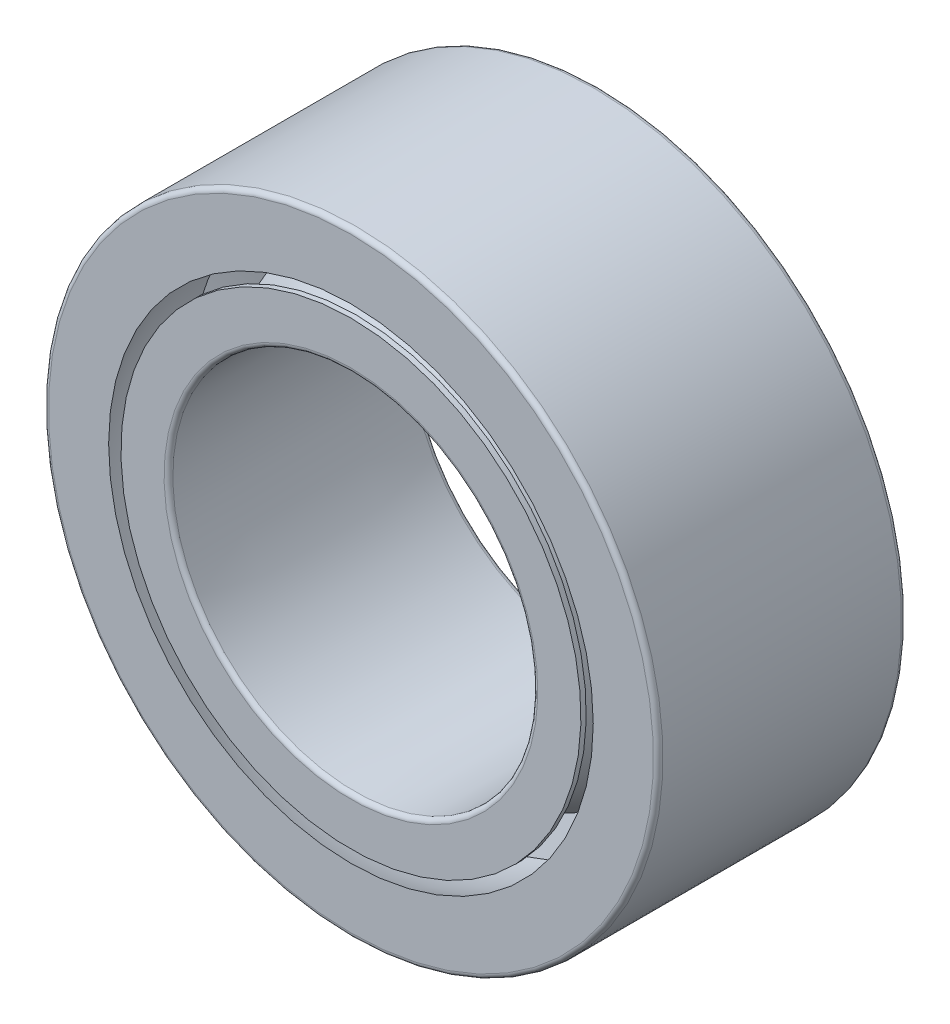
ISO-10303-21;
HEADER;
FILE_DESCRIPTION(('STEP AP214'),'2;1');
FILE_NAME('part.step','',(''),(''),'','','');
FILE_SCHEMA(('AUTOMOTIVE_DESIGN { 1 0 10303 214 1 1 1 1 }'));
ENDSEC;
DATA;
#1=APPLICATION_CONTEXT('core data for automotive mechanical design processes');
#2=APPLICATION_PROTOCOL_DEFINITION('international standard','automotive_design',2000,#1);
#3=PRODUCT_CONTEXT('',#1,'mechanical');
#4=PRODUCT('Part','Part','',(#3));
#5=PRODUCT_RELATED_PRODUCT_CATEGORY('part','',(#4));
#6=PRODUCT_DEFINITION_FORMATION('','',#4);
#7=PRODUCT_DEFINITION_CONTEXT('part definition',#1,'design');
#8=PRODUCT_DEFINITION('design','',#6,#7);
#9=PRODUCT_DEFINITION_SHAPE('','',#8);
#10=(LENGTH_UNIT() NAMED_UNIT(*) SI_UNIT(.MILLI.,.METRE.));
#11=(NAMED_UNIT(*) PLANE_ANGLE_UNIT() SI_UNIT($,.RADIAN.));
#12=(NAMED_UNIT(*) SI_UNIT($,.STERADIAN.) SOLID_ANGLE_UNIT());
#13=UNCERTAINTY_MEASURE_WITH_UNIT(LENGTH_MEASURE(1.E-05),#10,'distance_accuracy_value','');
#14=(GEOMETRIC_REPRESENTATION_CONTEXT(3) GLOBAL_UNCERTAINTY_ASSIGNED_CONTEXT((#13)) GLOBAL_UNIT_ASSIGNED_CONTEXT((#10,
#11,#12)) REPRESENTATION_CONTEXT('',''));
#15=CARTESIAN_POINT('',(0.,0.,0.));
#16=DIRECTION('',(0.,0.,1.));
#17=DIRECTION('',(1.,0.,0.));
#18=AXIS2_PLACEMENT_3D('',#15,#16,#17);
#19=CARTESIAN_POINT('',(0.,0.,0.215983214826385));
#20=DIRECTION('',(0.,0.,-1.));
#21=DIRECTION('',(0.,1.,0.));
#22=AXIS2_PLACEMENT_3D('',#19,#20,#21);
#23=TOROIDAL_SURFACE('',#22,8.36440106334698,0.21);
#24=CARTESIAN_POINT('',(0.,0.,0.00598445498479357));
#25=DIRECTION('',(0.,0.,-1.));
#26=DIRECTION('',(0.,1.,0.));
#27=AXIS2_PLACEMENT_3D('',#24,#25,#26);
#28=CIRCLE('',#27,8.36367935357589);
#29=CARTESIAN_POINT('',(0.,8.36367935357589,0.00598445498479357));
#30=VERTEX_POINT('',#29);
#31=EDGE_CURVE('E93',#30,#30,#28,.T.);
#32=ORIENTED_EDGE('',*,*,#31,.T.);
#33=EDGE_LOOP('',(#32));
#34=FACE_BOUND('',#33,.T.);
#35=CARTESIAN_POINT('',(0.,0.,0.212949127882489));
#36=DIRECTION('',(0.,0.,-1.));
#37=DIRECTION('',(0.,1.,0.));
#38=AXIS2_PLACEMENT_3D('',#35,#36,#37);
#39=CIRCLE('',#38,8.15442298278519);
#40=CARTESIAN_POINT('',(0.,8.15442298278519,0.212949127882489));
#41=VERTEX_POINT('',#40);
#42=EDGE_CURVE('E11',#41,#41,#39,.T.);
#43=ORIENTED_EDGE('',*,*,#42,.F.);
#44=EDGE_LOOP('',(#43));
#45=FACE_BOUND('',#44,.T.);
#46=ADVANCED_FACE('F47',(#34,#45),#23,.T.);
#47=CARTESIAN_POINT('',(0.,0.,10.7227020475824));
#48=DIRECTION('',(0.,0.,-1.));
#49=DIRECTION('',(0.,1.,0.));
#50=AXIS2_PLACEMENT_3D('',#47,#48,#49);
#51=CONICAL_SURFACE('',#50,8.00256187408309,0.0144485357741015);
#52=ORIENTED_EDGE('',*,*,#42,.T.);
#53=EDGE_LOOP('',(#52));
#54=FACE_BOUND('',#53,.T.);
#55=CARTESIAN_POINT('',(0.,0.,10.7227020475824));
#56=DIRECTION('',(0.,0.,-1.));
#57=DIRECTION('',(0.,1.,0.));
#58=AXIS2_PLACEMENT_3D('',#55,#56,#57);
#59=CIRCLE('',#58,8.00256187408309);
#60=CARTESIAN_POINT('',(0.,8.00256187408309,10.7227020475824));
#61=VERTEX_POINT('',#60);
#62=EDGE_CURVE('E53',#61,#61,#59,.T.);
#63=ORIENTED_EDGE('',*,*,#62,.F.);
#64=EDGE_LOOP('',(#63));
#65=FACE_BOUND('',#64,.T.);
#66=ADVANCED_FACE('F111',(#54,#65),#51,.F.);
#67=CARTESIAN_POINT('',(0.,0.,10.69));
#68=DIRECTION('',(0.,0.,-1.));
#69=DIRECTION('',(0.,1.,0.));
#70=AXIS2_PLACEMENT_3D('',#67,#68,#69);
#71=TOROIDAL_SURFACE('',#70,8.21,0.210000000000003);
#72=ORIENTED_EDGE('',*,*,#62,.T.);
#73=EDGE_LOOP('',(#72));
#74=FACE_BOUND('',#73,.T.);
#75=CARTESIAN_POINT('',(0.,0.,10.9));
#76=DIRECTION('',(0.,0.,-1.));
#77=DIRECTION('',(0.,1.,0.));
#78=AXIS2_PLACEMENT_3D('',#75,#76,#77);
#79=CIRCLE('',#78,8.21);
#80=CARTESIAN_POINT('',(0.,8.21,10.9));
#81=VERTEX_POINT('',#80);
#82=EDGE_CURVE('E57',#81,#81,#79,.T.);
#83=ORIENTED_EDGE('',*,*,#82,.F.);
#84=EDGE_LOOP('',(#83));
#85=FACE_BOUND('',#84,.T.);
#86=ADVANCED_FACE('F115',(#74,#85),#71,.T.);
#87=CARTESIAN_POINT('',(0.,10.105,10.9));
#88=DIRECTION('',(0.,0.,1.));
#89=DIRECTION('',(0.,-1.,0.));
#90=AXIS2_PLACEMENT_3D('',#87,#88,#89);
#91=PLANE('',#90);
#92=ORIENTED_EDGE('',*,*,#82,.T.);
#93=EDGE_LOOP('',(#92));
#94=FACE_BOUND('',#93,.T.);
#95=CARTESIAN_POINT('',(0.,0.,10.9));
#96=DIRECTION('',(0.,0.,-1.));
#97=DIRECTION('',(0.,1.,0.));
#98=AXIS2_PLACEMENT_3D('',#95,#96,#97);
#99=CIRCLE('',#98,10.105);
#100=CARTESIAN_POINT('',(0.,10.105,10.9));
#101=VERTEX_POINT('',#100);
#102=EDGE_CURVE('E61',#101,#101,#99,.T.);
#103=ORIENTED_EDGE('',*,*,#102,.F.);
#104=EDGE_LOOP('',(#103));
#105=FACE_BOUND('',#104,.T.);
#106=ADVANCED_FACE('F119',(#94,#105),#91,.T.);
#107=CARTESIAN_POINT('',(0.,0.,0.));
#108=DIRECTION('',(0.,0.,-1.));
#109=DIRECTION('',(0.,1.,0.));
#110=AXIS2_PLACEMENT_3D('',#107,#108,#109);
#111=CYLINDRICAL_SURFACE('',#110,10.105);
#112=ORIENTED_EDGE('',*,*,#102,.T.);
#113=EDGE_LOOP('',(#112));
#114=FACE_BOUND('',#113,.T.);
#115=CARTESIAN_POINT('',(0.,0.,10.6658168302942));
#116=DIRECTION('',(0.,0.,-1.));
#117=DIRECTION('',(0.,1.,0.));
#118=AXIS2_PLACEMENT_3D('',#115,#116,#117);
#119=CIRCLE('',#118,10.105);
#120=CARTESIAN_POINT('',(0.,10.105,10.6658168302942));
#121=VERTEX_POINT('',#120);
#122=EDGE_CURVE('E66',#121,#121,#119,.T.);
#123=ORIENTED_EDGE('',*,*,#122,.F.);
#124=EDGE_LOOP('',(#123));
#125=FACE_BOUND('',#124,.T.);
#126=ADVANCED_FACE('F125',(#114,#125),#111,.T.);
#127=CARTESIAN_POINT('',(0.,0.,10.243388813283));
#128=DIRECTION('',(0.,0.,1.));
#129=DIRECTION('',(0.,-1.,0.));
#130=AXIS2_PLACEMENT_3D('',#127,#128,#129);
#131=CONICAL_SURFACE('',#130,8.70654560385164,1.27744356633879);
#132=ORIENTED_EDGE('',*,*,#122,.T.);
#133=EDGE_LOOP('',(#132));
#134=FACE_BOUND('',#133,.T.);
#135=CARTESIAN_POINT('',(0.,0.,10.243388813283));
#136=DIRECTION('',(0.,0.,-1.));
#137=DIRECTION('',(0.,1.,0.));
#138=AXIS2_PLACEMENT_3D('',#135,#136,#137);
#139=CIRCLE('',#138,8.70654560385164);
#140=CARTESIAN_POINT('',(0.,8.70654560385164,10.243388813283));
#141=VERTEX_POINT('',#140);
#142=EDGE_CURVE('E69',#141,#141,#139,.T.);
#143=ORIENTED_EDGE('',*,*,#142,.F.);
#144=EDGE_LOOP('',(#143));
#145=FACE_BOUND('',#144,.T.);
#146=ADVANCED_FACE('F129',(#134,#145),#131,.T.);
#147=CARTESIAN_POINT('',(0.,0.,11.6670125424085));
#148=DIRECTION('',(0.,0.,-1.));
#149=DIRECTION('',(0.,1.,0.));
#150=AXIS2_PLACEMENT_3D('',#147,#148,#149);
#151=TOROIDAL_SURFACE('',#150,20.5815148870907,11.96);
#152=ORIENTED_EDGE('',*,*,#142,.T.);
#153=EDGE_LOOP('',(#152));
#154=FACE_BOUND('',#153,.T.);
#155=CARTESIAN_POINT('',(0.,0.,6.27833603829089));
#156=DIRECTION('',(0.,0.,-1.));
#157=DIRECTION('',(0.,1.,0.));
#158=AXIS2_PLACEMENT_3D('',#155,#156,#157);
#159=CIRCLE('',#158,9.90426029923099);
#160=CARTESIAN_POINT('',(0.,9.90426029923099,6.27833603829089));
#161=VERTEX_POINT('',#160);
#162=EDGE_CURVE('E72',#161,#161,#159,.T.);
#163=ORIENTED_EDGE('',*,*,#162,.F.);
#164=EDGE_LOOP('',(#163));
#165=FACE_BOUND('',#164,.T.);
#166=ADVANCED_FACE('F133',(#154,#165),#151,.F.);
#167=CARTESIAN_POINT('',(0.,0.,6.7007640553021));
#168=DIRECTION('',(0.,0.,1.));
#169=DIRECTION('',(0.,-1.,0.));
#170=AXIS2_PLACEMENT_3D('',#167,#168,#169);
#171=CONICAL_SURFACE('',#170,11.3027146953793,1.27744356633877);
#172=ORIENTED_EDGE('',*,*,#162,.T.);
#173=EDGE_LOOP('',(#172));
#174=FACE_BOUND('',#173,.T.);
#175=CARTESIAN_POINT('',(0.,0.,6.7007640553021));
#176=DIRECTION('',(0.,0.,-1.));
#177=DIRECTION('',(0.,1.,0.));
#178=AXIS2_PLACEMENT_3D('',#175,#176,#177);
#179=CIRCLE('',#178,11.3027146953793);
#180=CARTESIAN_POINT('',(0.,11.3027146953793,6.7007640553021));
#181=VERTEX_POINT('',#180);
#182=EDGE_CURVE('E75',#181,#181,#179,.T.);
#183=ORIENTED_EDGE('',*,*,#182,.F.);
#184=EDGE_LOOP('',(#183));
#185=FACE_BOUND('',#184,.T.);
#186=ADVANCED_FACE('F137',(#174,#185),#171,.F.);
#187=CARTESIAN_POINT('',(0.,0.,0.));
#188=DIRECTION('',(0.,0.,-1.));
#189=DIRECTION('',(0.,1.,0.));
#190=AXIS2_PLACEMENT_3D('',#187,#188,#189);
#191=CYLINDRICAL_SURFACE('',#190,11.3027146953793);
#192=ORIENTED_EDGE('',*,*,#182,.T.);
#193=EDGE_LOOP('',(#192));
#194=FACE_BOUND('',#193,.T.);
#195=CARTESIAN_POINT('',(0.,0.,4.1992359446979));
#196=DIRECTION('',(0.,0.,-1.));
#197=DIRECTION('',(0.,1.,0.));
#198=AXIS2_PLACEMENT_3D('',#195,#196,#197);
#199=CIRCLE('',#198,11.3027146953793);
#200=CARTESIAN_POINT('',(0.,11.3027146953793,4.1992359446979));
#201=VERTEX_POINT('',#200);
#202=EDGE_CURVE('E78',#201,#201,#199,.T.);
#203=ORIENTED_EDGE('',*,*,#202,.F.);
#204=EDGE_LOOP('',(#203));
#205=FACE_BOUND('',#204,.T.);
#206=ADVANCED_FACE('F141',(#194,#205),#191,.T.);
#207=CARTESIAN_POINT('',(0.,0.,4.62166396170909));
#208=DIRECTION('',(0.,0.,-1.));
#209=DIRECTION('',(0.,1.,0.));
#210=AXIS2_PLACEMENT_3D('',#207,#208,#209);
#211=CONICAL_SURFACE('',#210,9.90426029923099,1.27744356633878);
#212=ORIENTED_EDGE('',*,*,#202,.T.);
#213=EDGE_LOOP('',(#212));
#214=FACE_BOUND('',#213,.T.);
#215=CARTESIAN_POINT('',(0.,0.,4.62166396170909));
#216=DIRECTION('',(0.,0.,-1.));
#217=DIRECTION('',(0.,1.,0.));
#218=AXIS2_PLACEMENT_3D('',#215,#216,#217);
#219=CIRCLE('',#218,9.90426029923099);
#220=CARTESIAN_POINT('',(0.,9.90426029923099,4.62166396170909));
#221=VERTEX_POINT('',#220);
#222=EDGE_CURVE('E81',#221,#221,#219,.T.);
#223=ORIENTED_EDGE('',*,*,#222,.F.);
#224=EDGE_LOOP('',(#223));
#225=FACE_BOUND('',#224,.T.);
#226=ADVANCED_FACE('F145',(#214,#225),#211,.F.);
#227=CARTESIAN_POINT('',(0.,0.,-0.767012542408448));
#228=DIRECTION('',(0.,0.,-1.));
#229=DIRECTION('',(0.,1.,0.));
#230=AXIS2_PLACEMENT_3D('',#227,#228,#229);
#231=TOROIDAL_SURFACE('',#230,20.5815148870908,11.96);
#232=ORIENTED_EDGE('',*,*,#222,.T.);
#233=EDGE_LOOP('',(#232));
#234=FACE_BOUND('',#233,.T.);
#235=CARTESIAN_POINT('',(0.,0.,0.656611186716981));
#236=DIRECTION('',(0.,0.,-1.));
#237=DIRECTION('',(0.,1.,0.));
#238=AXIS2_PLACEMENT_3D('',#235,#236,#237);
#239=CIRCLE('',#238,8.70654560385168);
#240=CARTESIAN_POINT('',(0.,8.70654560385168,0.656611186716981));
#241=VERTEX_POINT('',#240);
#242=EDGE_CURVE('E84',#241,#241,#239,.T.);
#243=ORIENTED_EDGE('',*,*,#242,.F.);
#244=EDGE_LOOP('',(#243));
#245=FACE_BOUND('',#244,.T.);
#246=ADVANCED_FACE('F149',(#234,#245),#231,.F.);
#247=CARTESIAN_POINT('',(0.,0.,0.23418316970579));
#248=DIRECTION('',(0.,0.,-1.));
#249=DIRECTION('',(0.,1.,0.));
#250=AXIS2_PLACEMENT_3D('',#247,#248,#249);
#251=CONICAL_SURFACE('',#250,10.105,1.27744356633879);
#252=ORIENTED_EDGE('',*,*,#242,.T.);
#253=EDGE_LOOP('',(#252));
#254=FACE_BOUND('',#253,.T.);
#255=CARTESIAN_POINT('',(0.,0.,0.23418316970579));
#256=DIRECTION('',(0.,0.,-1.));
#257=DIRECTION('',(0.,1.,0.));
#258=AXIS2_PLACEMENT_3D('',#255,#256,#257);
#259=CIRCLE('',#258,10.105);
#260=CARTESIAN_POINT('',(0.,10.105,0.23418316970579));
#261=VERTEX_POINT('',#260);
#262=EDGE_CURVE('E87',#261,#261,#259,.T.);
#263=ORIENTED_EDGE('',*,*,#262,.F.);
#264=EDGE_LOOP('',(#263));
#265=FACE_BOUND('',#264,.T.);
#266=ADVANCED_FACE('F107',(#254,#265),#251,.T.);
#267=CARTESIAN_POINT('',(0.,0.,0.));
#268=DIRECTION('',(0.,0.,-1.));
#269=DIRECTION('',(0.,1.,0.));
#270=AXIS2_PLACEMENT_3D('',#267,#268,#269);
#271=CYLINDRICAL_SURFACE('',#270,10.105);
#272=ORIENTED_EDGE('',*,*,#262,.T.);
#273=EDGE_LOOP('',(#272));
#274=FACE_BOUND('',#273,.T.);
#275=CARTESIAN_POINT('',(0.,0.,0.));
#276=DIRECTION('',(0.,0.,-1.));
#277=DIRECTION('',(0.,1.,0.));
#278=AXIS2_PLACEMENT_3D('',#275,#276,#277);
#279=CIRCLE('',#278,10.105);
#280=CARTESIAN_POINT('',(0.,10.105,0.));
#281=VERTEX_POINT('',#280);
#282=EDGE_CURVE('E90',#281,#281,#279,.T.);
#283=ORIENTED_EDGE('',*,*,#282,.F.);
#284=EDGE_LOOP('',(#283));
#285=FACE_BOUND('',#284,.T.);
#286=ADVANCED_FACE('F101',(#274,#285),#271,.T.);
#287=CARTESIAN_POINT('',(0.,0.,0.00598445498479357));
#288=DIRECTION('',(0.,0.,-1.));
#289=DIRECTION('',(0.,1.,0.));
#290=AXIS2_PLACEMENT_3D('',#287,#288,#289);
#291=CONICAL_SURFACE('',#290,8.36367935357589,1.56735960683399);
#292=ORIENTED_EDGE('',*,*,#282,.T.);
#293=EDGE_LOOP('',(#292));
#294=FACE_BOUND('',#293,.T.);
#295=ORIENTED_EDGE('',*,*,#31,.F.);
#296=EDGE_LOOP('',(#295));
#297=FACE_BOUND('',#296,.T.);
#298=ADVANCED_FACE('F99',(#294,#297),#291,.F.);
#299=CLOSED_SHELL('',(#46,#66,#86,#106,#126,#146,#166,#186,#206,#226,#246,#266,#286,#298));
#300=MANIFOLD_SOLID_BREP('B2',#299);
#301=CARTESIAN_POINT('',(0.,0.,0.210000000000002));
#302=DIRECTION('',(0.,0.,-1.));
#303=DIRECTION('',(0.,1.,0.));
#304=AXIS2_PLACEMENT_3D('',#301,#302,#303);
#305=TOROIDAL_SURFACE('',#304,13.29,0.209999999999999);
#306=CARTESIAN_POINT('',(0.,0.,0.210000000000002));
#307=DIRECTION('',(0.,0.,-1.));
#308=DIRECTION('',(0.,1.,0.));
#309=AXIS2_PLACEMENT_3D('',#306,#307,#308);
#310=CIRCLE('',#309,13.5);
#311=CARTESIAN_POINT('',(0.,13.5,0.210000000000002));
#312=VERTEX_POINT('',#311);
#313=EDGE_CURVE('E46',#312,#312,#310,.T.);
#314=ORIENTED_EDGE('',*,*,#313,.T.);
#315=EDGE_LOOP('',(#314));
#316=FACE_BOUND('',#315,.T.);
#317=CARTESIAN_POINT('',(0.,0.,0.));
#318=DIRECTION('',(0.,0.,-1.));
#319=DIRECTION('',(0.,1.,0.));
#320=AXIS2_PLACEMENT_3D('',#317,#318,#319);
#321=CIRCLE('',#320,13.2900000000004);
#322=CARTESIAN_POINT('',(0.,13.2900000000004,0.));
#323=VERTEX_POINT('',#322);
#324=EDGE_CURVE('E280',#323,#323,#321,.T.);
#325=ORIENTED_EDGE('',*,*,#324,.F.);
#326=EDGE_LOOP('',(#325));
#327=FACE_BOUND('',#326,.T.);
#328=ADVANCED_FACE('F258',(#316,#327),#305,.T.);
#329=CARTESIAN_POINT('',(0.,0.,0.));
#330=DIRECTION('',(0.,0.,-1.));
#331=DIRECTION('',(0.,1.,0.));
#332=AXIS2_PLACEMENT_3D('',#329,#330,#331);
#333=CYLINDRICAL_SURFACE('',#332,13.5);
#334=CARTESIAN_POINT('',(0.,0.,10.69));
#335=DIRECTION('',(0.,0.,-1.));
#336=DIRECTION('',(0.,1.,0.));
#337=AXIS2_PLACEMENT_3D('',#334,#335,#336);
#338=CIRCLE('',#337,13.5);
#339=CARTESIAN_POINT('',(0.,13.5,10.69));
#340=VERTEX_POINT('',#339);
#341=EDGE_CURVE('E264',#340,#340,#338,.T.);
#342=ORIENTED_EDGE('',*,*,#341,.T.);
#343=EDGE_LOOP('',(#342));
#344=FACE_BOUND('',#343,.T.);
#345=ORIENTED_EDGE('',*,*,#313,.F.);
#346=EDGE_LOOP('',(#345));
#347=FACE_BOUND('',#346,.T.);
#348=ADVANCED_FACE('F288',(#344,#347),#333,.T.);
#349=CARTESIAN_POINT('',(0.,0.,10.69));
#350=DIRECTION('',(0.,0.,-1.));
#351=DIRECTION('',(0.,1.,0.));
#352=AXIS2_PLACEMENT_3D('',#349,#350,#351);
#353=TOROIDAL_SURFACE('',#352,13.29,0.209999999999999);
#354=CARTESIAN_POINT('',(0.,0.,10.9));
#355=DIRECTION('',(0.,0.,-1.));
#356=DIRECTION('',(0.,1.,0.));
#357=AXIS2_PLACEMENT_3D('',#354,#355,#356);
#358=CIRCLE('',#357,13.2900000000004);
#359=CARTESIAN_POINT('',(0.,13.2900000000004,10.9));
#360=VERTEX_POINT('',#359);
#361=EDGE_CURVE('E268',#360,#360,#358,.T.);
#362=ORIENTED_EDGE('',*,*,#361,.T.);
#363=EDGE_LOOP('',(#362));
#364=FACE_BOUND('',#363,.T.);
#365=ORIENTED_EDGE('',*,*,#341,.F.);
#366=EDGE_LOOP('',(#365));
#367=FACE_BOUND('',#366,.T.);
#368=ADVANCED_FACE('F292',(#364,#367),#353,.T.);
#369=CARTESIAN_POINT('',(0.,13.2900000000004,10.9));
#370=DIRECTION('',(0.,0.,1.));
#371=DIRECTION('',(0.,-1.,0.));
#372=AXIS2_PLACEMENT_3D('',#369,#370,#371);
#373=PLANE('',#372);
#374=CARTESIAN_POINT('',(0.,0.,10.9));
#375=DIRECTION('',(0.,0.,-1.));
#376=DIRECTION('',(0.,1.,0.));
#377=AXIS2_PLACEMENT_3D('',#374,#375,#376);
#378=CIRCLE('',#377,10.6460837870086);
#379=CARTESIAN_POINT('',(0.,10.6460837870086,10.9));
#380=VERTEX_POINT('',#379);
#381=EDGE_CURVE('E272',#380,#380,#378,.T.);
#382=ORIENTED_EDGE('',*,*,#381,.T.);
#383=EDGE_LOOP('',(#382));
#384=FACE_BOUND('',#383,.T.);
#385=ORIENTED_EDGE('',*,*,#361,.F.);
#386=EDGE_LOOP('',(#385));
#387=FACE_BOUND('',#386,.T.);
#388=ADVANCED_FACE('F296',(#384,#387),#373,.T.);
#389=CARTESIAN_POINT('',(0.,0.,5.44999999999999));
#390=DIRECTION('',(0.,0.,-1.));
#391=DIRECTION('',(0.,1.,0.));
#392=AXIS2_PLACEMENT_3D('',#389,#390,#391);
#393=SPHERICAL_SURFACE('',#392,11.9600000000003);
#394=CARTESIAN_POINT('',(0.,0.,0.));
#395=DIRECTION('',(0.,0.,-1.));
#396=DIRECTION('',(0.,1.,0.));
#397=AXIS2_PLACEMENT_3D('',#394,#395,#396);
#398=CIRCLE('',#397,10.6460837870086);
#399=CARTESIAN_POINT('',(0.,10.6460837870086,0.));
#400=VERTEX_POINT('',#399);
#401=EDGE_CURVE('E277',#400,#400,#398,.T.);
#402=CARTESIAN_POINT('',(0.,10.6460837870086,0.));
#403=CARTESIAN_POINT('',(0.,10.6998056463676,0.104939609526295));
#404=CARTESIAN_POINT('',(0.,10.7519749275558,0.210673991658528));
#405=CARTESIAN_POINT('',(0.,10.8531648879232,0.423638814897642));
#406=CARTESIAN_POINT('',(0.,10.9021855671025,0.530869256004523));
#407=CARTESIAN_POINT('',(0.,10.9970348777851,0.746732710955699));
#408=CARTESIAN_POINT('',(0.,11.0428635092883,0.855365724799995));
#409=CARTESIAN_POINT('',(0.,11.1312888077935,1.07393926205388));
#410=CARTESIAN_POINT('',(0.,11.1738854747955,1.18387978546346));
#411=CARTESIAN_POINT('',(0.,11.2558095558472,1.40497222930633));
#412=CARTESIAN_POINT('',(0.,11.2951369698968,1.51612414973962));
#413=CARTESIAN_POINT('',(0.,11.3704881682042,1.73954219067217));
#414=CARTESIAN_POINT('',(0.,11.4065119524619,1.85180831117144));
#415=CARTESIAN_POINT('',(0.,11.4752243888596,2.07735658776095));
#416=CARTESIAN_POINT('',(0.,11.5079130409996,2.19063874385119));
#417=CARTESIAN_POINT('',(0.,11.5699266308903,2.4181200369156));
#418=CARTESIAN_POINT('',(0.,11.599251568641,2.53231917388978));
#419=CARTESIAN_POINT('',(0.,11.6545120877066,2.76153457268779));
#420=CARTESIAN_POINT('',(0.,11.6804476690215,2.87655083451161));
#421=CARTESIAN_POINT('',(0.,11.7289067971076,3.10729991234801));
#422=CARTESIAN_POINT('',(0.,11.7514303438788,3.22303272836058));
#423=CARTESIAN_POINT('',(0.,11.7930457081915,3.45511371739073));
#424=CARTESIAN_POINT('',(0.,11.812137525733,3.57146189040831));
#425=CARTESIAN_POINT('',(0.,11.8468727376366,3.80467185818508));
#426=CARTESIAN_POINT('',(0.,11.8625161319987,3.92153365294426));
#427=CARTESIAN_POINT('',(0.,11.8903408189018,4.15566867983061));
#428=CARTESIAN_POINT('',(0.,11.9025221114429,4.27294191195777));
#429=CARTESIAN_POINT('',(0.,11.9234119433383,4.50779726944347));
#430=CARTESIAN_POINT('',(0.,11.9321204826927,4.62537939480201));
#431=CARTESIAN_POINT('',(0.,11.9460571934365,4.86074972451668));
#432=CARTESIAN_POINT('',(0.,11.9512853648259,4.97853792887281));
#433=CARTESIAN_POINT('',(0.,11.9582567681078,5.21421742215263));
#434=CARTESIAN_POINT('',(0.,11.9600000000003,5.33210871107632));
#435=CARTESIAN_POINT('',(0.,11.9600000000003,5.56789128892368));
#436=CARTESIAN_POINT('',(0.,11.9582567681078,5.68578257784737));
#437=CARTESIAN_POINT('',(0.,11.9512853648258,5.92146207112719));
#438=CARTESIAN_POINT('',(0.,11.9460571934365,6.03925027548332));
#439=CARTESIAN_POINT('',(0.,11.9321204826927,6.27462060519799));
#440=CARTESIAN_POINT('',(0.,11.9234119433383,6.39220273055653));
#441=CARTESIAN_POINT('',(0.,11.9025221114429,6.62705808804223));
#442=CARTESIAN_POINT('',(0.,11.8903408189018,6.7443313201694));
#443=CARTESIAN_POINT('',(0.,11.8625161319987,6.97846634705574));
#444=CARTESIAN_POINT('',(0.,11.8468727376366,7.09532814181493));
#445=CARTESIAN_POINT('',(0.,11.812137525733,7.32853810959169));
#446=CARTESIAN_POINT('',(0.,11.7930457081915,7.44488628260927));
#447=CARTESIAN_POINT('',(0.,11.7514303438788,7.67696727163942));
#448=CARTESIAN_POINT('',(0.,11.7289067971076,7.79270008765199));
#449=CARTESIAN_POINT('',(0.,11.6804476690215,8.02344916548839));
#450=CARTESIAN_POINT('',(0.,11.6545120877066,8.13846542731221));
#451=CARTESIAN_POINT('',(0.,11.599251568641,8.36768082611022));
#452=CARTESIAN_POINT('',(0.,11.5699266308903,8.4818799630844));
#453=CARTESIAN_POINT('',(0.,11.5079130409996,8.70936125614881));
#454=CARTESIAN_POINT('',(0.,11.4752243888596,8.82264341223905));
#455=CARTESIAN_POINT('',(0.,11.4065119524619,9.04819168882856));
#456=CARTESIAN_POINT('',(0.,11.3704881682042,9.16045780932783));
#457=CARTESIAN_POINT('',(0.,11.2951369698968,9.38387585026038));
#458=CARTESIAN_POINT('',(0.,11.2558095558471,9.49502777069367));
#459=CARTESIAN_POINT('',(0.,11.1738854747955,9.71612021453654));
#460=CARTESIAN_POINT('',(0.,11.1312888077935,9.82606073794612));
#461=CARTESIAN_POINT('',(0.,11.0428635092883,10.0446342752));
#462=CARTESIAN_POINT('',(0.,10.9970348777851,10.1532672890443));
#463=CARTESIAN_POINT('',(0.,10.9021855671025,10.3691307439955));
#464=CARTESIAN_POINT('',(0.,10.8531648879232,10.4763611851024));
#465=CARTESIAN_POINT('',(0.,10.7519749275558,10.6893260083415));
#466=CARTESIAN_POINT('',(0.,10.6998056463676,10.7950603904737));
#467=CARTESIAN_POINT('',(0.,10.6460837870086,10.9));
#468=B_SPLINE_CURVE_WITH_KNOTS('',3,(#402,#403,#404,#405,#406,#407,#408,#409,#410,#411,#412,
#413,#414,#415,#416,#417,#418,#419,#420,#421,#422,#423,#424,#425,#426,#427,#428,#429,#430,#431,
#432,#433,#434,#435,#436,#437,#438,#439,#440,#441,#442,#443,#444,#445,#446,#447,#448,#449,#450,
#451,#452,#453,#454,#455,#456,#457,#458,#459,#460,#461,#462,#463,#464,#465,#466,#467),
.UNSPECIFIED.,.F.,.F.,(4,2,2,2,2,2,2,2,2,2,2,2,2,2,2,2,2,2,2,2,2,2,2,2,2,2,2,2,2,2,2,2,4),(0.,
0.35366098190454,0.707321963809078,1.06098294571362,1.41464392761816,1.7683049095227,
2.12196589142724,2.47562687333178,2.82928785523632,3.18294883714085,3.53660981904539,
3.89027080094993,4.24393178285447,4.59759276475901,4.95125374666355,5.30491472856809,
5.65857571047263,6.01223669237717,6.36589767428171,6.71955865618625,7.07321963809079,
7.42688061999533,7.78054160189987,8.13420258380441,8.48786356570895,8.84152454761349,
9.19518552951803,9.54884651142257,9.90250749332711,10.2561684752316,10.6098294571362,
10.9634904390407,11.3171514209453),.UNSPECIFIED.);
#469=EDGE_CURVE('BSEAM303',#400,#380,#468,.T.);
#470=ORIENTED_EDGE('',*,*,#401,.T.);
#471=ORIENTED_EDGE('',*,*,#381,.F.);
#472=ORIENTED_EDGE('',*,*,#469,.T.);
#473=ORIENTED_EDGE('',*,*,#469,.F.);
#474=EDGE_LOOP('',(#470,#472,#471,#473));
#475=FACE_BOUND('',#474,.T.);
#476=ADVANCED_FACE('F303',(#475),#393,.F.);
#477=CARTESIAN_POINT('',(0.,13.2900000000004,0.));
#478=DIRECTION('',(0.,0.,-1.));
#479=DIRECTION('',(0.,1.,0.));
#480=AXIS2_PLACEMENT_3D('',#477,#478,#479);
#481=PLANE('',#480);
#482=ORIENTED_EDGE('',*,*,#324,.T.);
#483=EDGE_LOOP('',(#482));
#484=FACE_BOUND('',#483,.T.);
#485=ORIENTED_EDGE('',*,*,#401,.F.);
#486=EDGE_LOOP('',(#485));
#487=FACE_BOUND('',#486,.T.);
#488=ADVANCED_FACE('F284',(#484,#487),#481,.T.);
#489=CLOSED_SHELL('',(#328,#348,#368,#388,#476,#488));
#490=MANIFOLD_SOLID_BREP('B6',#489);
#491=ADVANCED_BREP_SHAPE_REPRESENTATION('',(#18,#300,#490),#14);
#492=SHAPE_DEFINITION_REPRESENTATION(#9,#491);
ENDSEC;
END-ISO-10303-21;
